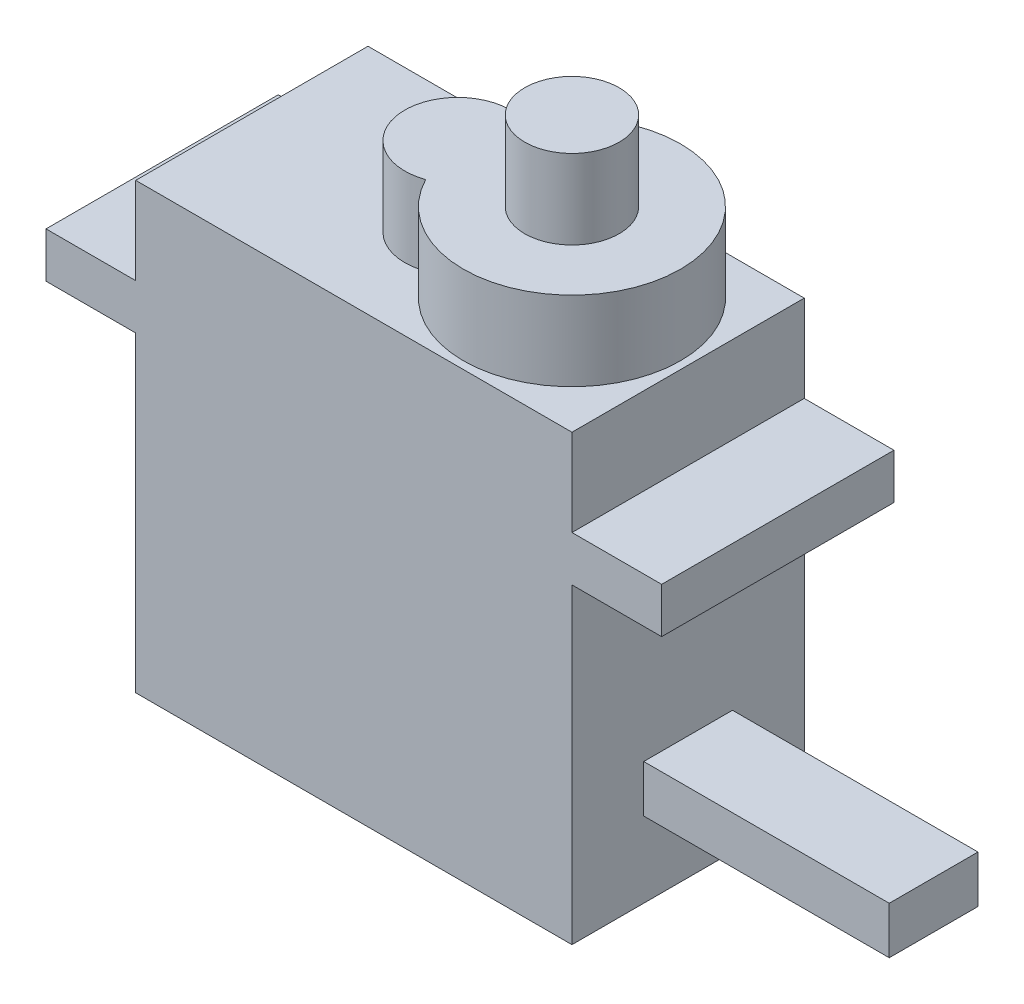
ISO-10303-21;
HEADER;
FILE_DESCRIPTION(('STEP AP214'),'2;1');
FILE_NAME('part.step','',(''),(''),'','','');
FILE_SCHEMA(('AUTOMOTIVE_DESIGN { 1 0 10303 214 1 1 1 1 }'));
ENDSEC;
DATA;
#1=APPLICATION_CONTEXT('core data for automotive mechanical design processes');
#2=APPLICATION_PROTOCOL_DEFINITION('international standard','automotive_design',2000,#1);
#3=PRODUCT_CONTEXT('',#1,'mechanical');
#4=PRODUCT('Part','Part','',(#3));
#5=PRODUCT_RELATED_PRODUCT_CATEGORY('part','',(#4));
#6=PRODUCT_DEFINITION_FORMATION('','',#4);
#7=PRODUCT_DEFINITION_CONTEXT('part definition',#1,'design');
#8=PRODUCT_DEFINITION('design','',#6,#7);
#9=PRODUCT_DEFINITION_SHAPE('','',#8);
#10=(LENGTH_UNIT() NAMED_UNIT(*) SI_UNIT(.MILLI.,.METRE.));
#11=(NAMED_UNIT(*) PLANE_ANGLE_UNIT() SI_UNIT($,.RADIAN.));
#12=(NAMED_UNIT(*) SI_UNIT($,.STERADIAN.) SOLID_ANGLE_UNIT());
#13=UNCERTAINTY_MEASURE_WITH_UNIT(LENGTH_MEASURE(1.E-05),#10,'distance_accuracy_value','');
#14=(GEOMETRIC_REPRESENTATION_CONTEXT(3) GLOBAL_UNCERTAINTY_ASSIGNED_CONTEXT((#13)) GLOBAL_UNIT_ASSIGNED_CONTEXT((#10,
#11,#12)) REPRESENTATION_CONTEXT('',''));
#15=CARTESIAN_POINT('',(0.,0.,0.));
#16=DIRECTION('',(0.,0.,1.));
#17=DIRECTION('',(1.,0.,0.));
#18=AXIS2_PLACEMENT_3D('',#15,#16,#17);
#19=CARTESIAN_POINT('',(11.55,0.,12.3));
#20=DIRECTION('',(1.,0.,0.));
#21=DIRECTION('',(0.,1.,0.));
#22=AXIS2_PLACEMENT_3D('',#19,#20,#21);
#23=PLANE('',#22);
#24=DIRECTION('',(0.,-1.,0.));
#25=VECTOR('',#24,1.);
#26=CARTESIAN_POINT('',(11.55,0.,0.));
#27=LINE('',#26,#25);
#28=CARTESIAN_POINT('',(11.55,4.75,0.));
#29=VERTEX_POINT('',#28);
#30=CARTESIAN_POINT('',(11.55,-11.75,0.));
#31=VERTEX_POINT('',#30);
#32=EDGE_CURVE('E286',#29,#31,#27,.T.);
#33=ORIENTED_EDGE('',*,*,#32,.F.);
#34=DIRECTION('',(0.,0.,-1.));
#35=VECTOR('',#34,1.);
#36=CARTESIAN_POINT('',(11.55,4.75,12.3));
#37=LINE('',#36,#35);
#38=CARTESIAN_POINT('',(11.55,4.75,12.3));
#39=VERTEX_POINT('',#38);
#40=EDGE_CURVE('E312',#39,#29,#37,.T.);
#41=ORIENTED_EDGE('',*,*,#40,.F.);
#42=DIRECTION('',(0.,-1.,0.));
#43=VECTOR('',#42,1.);
#44=CARTESIAN_POINT('',(11.55,0.,12.3));
#45=LINE('',#44,#43);
#46=CARTESIAN_POINT('',(11.55,-11.75,12.3));
#47=VERTEX_POINT('',#46);
#48=EDGE_CURVE('E254',#39,#47,#45,.T.);
#49=ORIENTED_EDGE('',*,*,#48,.T.);
#50=DIRECTION('',(0.,0.,-1.));
#51=VECTOR('',#50,1.);
#52=CARTESIAN_POINT('',(11.55,-11.75,12.3));
#53=LINE('',#52,#51);
#54=EDGE_CURVE('E314',#47,#31,#53,.T.);
#55=ORIENTED_EDGE('',*,*,#54,.T.);
#56=EDGE_LOOP('',(#33,#41,#49,#55));
#57=FACE_BOUND('',#56,.T.);
#58=DIRECTION('',(0.,-1.,0.));
#59=VECTOR('',#58,1.);
#60=CARTESIAN_POINT('',(11.55,-5.25,3.8));
#61=LINE('',#60,#59);
#62=CARTESIAN_POINT('',(11.55,-5.25,3.8));
#63=VERTEX_POINT('',#62);
#64=CARTESIAN_POINT('',(11.55,-7.75,3.8));
#65=VERTEX_POINT('',#64);
#66=EDGE_CURVE('E210',#63,#65,#61,.T.);
#67=ORIENTED_EDGE('',*,*,#66,.T.);
#68=DIRECTION('',(0.,0.,-1.));
#69=VECTOR('',#68,1.);
#70=CARTESIAN_POINT('',(11.55,-7.75,8.5));
#71=LINE('',#70,#69);
#72=CARTESIAN_POINT('',(11.55,-7.75,8.5));
#73=VERTEX_POINT('',#72);
#74=EDGE_CURVE('E208',#73,#65,#71,.T.);
#75=ORIENTED_EDGE('',*,*,#74,.F.);
#76=DIRECTION('',(0.,-1.,0.));
#77=VECTOR('',#76,1.);
#78=CARTESIAN_POINT('',(11.55,-5.25,8.5));
#79=LINE('',#78,#77);
#80=CARTESIAN_POINT('',(11.55,-5.25,8.5));
#81=VERTEX_POINT('',#80);
#82=EDGE_CURVE('E182',#81,#73,#79,.T.);
#83=ORIENTED_EDGE('',*,*,#82,.F.);
#84=DIRECTION('',(0.,0.,-1.));
#85=VECTOR('',#84,1.);
#86=CARTESIAN_POINT('',(11.55,-5.25,8.5));
#87=LINE('',#86,#85);
#88=EDGE_CURVE('E67',#81,#63,#87,.T.);
#89=ORIENTED_EDGE('',*,*,#88,.T.);
#90=EDGE_LOOP('',(#67,#75,#83,#89));
#91=FACE_BOUND('',#90,.T.);
#92=ADVANCED_FACE('F51',(#57,#91),#23,.T.);
#93=CARTESIAN_POINT('',(-11.55,0.,12.3));
#94=DIRECTION('',(1.,0.,0.));
#95=DIRECTION('',(0.,1.,0.));
#96=AXIS2_PLACEMENT_3D('',#93,#94,#95);
#97=PLANE('',#96);
#98=DIRECTION('',(0.,-1.,0.));
#99=VECTOR('',#98,1.);
#100=CARTESIAN_POINT('',(-11.55,0.,0.));
#101=LINE('',#100,#99);
#102=CARTESIAN_POINT('',(-11.55,11.75,0.));
#103=VERTEX_POINT('',#102);
#104=CARTESIAN_POINT('',(-11.55,7.15,0.));
#105=VERTEX_POINT('',#104);
#106=EDGE_CURVE('E239',#103,#105,#101,.T.);
#107=ORIENTED_EDGE('',*,*,#106,.T.);
#108=DIRECTION('',(0.,0.,-1.));
#109=VECTOR('',#108,1.);
#110=CARTESIAN_POINT('',(-11.55,7.15,12.3));
#111=LINE('',#110,#109);
#112=CARTESIAN_POINT('',(-11.55,7.15,12.3));
#113=VERTEX_POINT('',#112);
#114=EDGE_CURVE('E11',#113,#105,#111,.T.);
#115=ORIENTED_EDGE('',*,*,#114,.F.);
#116=DIRECTION('',(0.,-1.,0.));
#117=VECTOR('',#116,1.);
#118=CARTESIAN_POINT('',(-11.55,0.,12.3));
#119=LINE('',#118,#117);
#120=CARTESIAN_POINT('',(-11.55,11.75,12.3));
#121=VERTEX_POINT('',#120);
#122=EDGE_CURVE('E240',#121,#113,#119,.T.);
#123=ORIENTED_EDGE('',*,*,#122,.F.);
#124=DIRECTION('',(0.,0.,-1.));
#125=VECTOR('',#124,1.);
#126=CARTESIAN_POINT('',(-11.55,11.75,12.3));
#127=LINE('',#126,#125);
#128=EDGE_CURVE('E271',#121,#103,#127,.T.);
#129=ORIENTED_EDGE('',*,*,#128,.T.);
#130=EDGE_LOOP('',(#107,#115,#123,#129));
#131=FACE_BOUND('',#130,.T.);
#132=ADVANCED_FACE('F53',(#131),#97,.F.);
#133=CARTESIAN_POINT('',(0.,7.15,12.3));
#134=DIRECTION('',(0.,1.,0.));
#135=DIRECTION('',(-1.,0.,0.));
#136=AXIS2_PLACEMENT_3D('',#133,#134,#135);
#137=PLANE('',#136);
#138=CARTESIAN_POINT('',(-13.925,7.15,6.15));
#139=DIRECTION('',(0.,1.,0.));
#140=DIRECTION('',(-1.,0.,0.));
#141=AXIS2_PLACEMENT_3D('',#138,#139,#140);
#142=CIRCLE('',#141,0.965000000000001);
#143=CARTESIAN_POINT('',(-14.89,7.15,6.15));
#144=VERTEX_POINT('',#143);
#145=EDGE_CURVE('E203',#144,#144,#142,.T.);
#146=ORIENTED_EDGE('',*,*,#145,.F.);
#147=EDGE_LOOP('',(#146));
#148=FACE_BOUND('',#147,.T.);
#149=DIRECTION('',(1.,0.,0.));
#150=VECTOR('',#149,1.);
#151=CARTESIAN_POINT('',(0.,7.15,0.));
#152=LINE('',#151,#150);
#153=CARTESIAN_POINT('',(-16.3,7.15,0.));
#154=VERTEX_POINT('',#153);
#155=EDGE_CURVE('E274',#154,#105,#152,.T.);
#156=ORIENTED_EDGE('',*,*,#155,.F.);
#157=DIRECTION('',(0.,0.,-1.));
#158=VECTOR('',#157,1.);
#159=CARTESIAN_POINT('',(-16.3,7.15,12.3));
#160=LINE('',#159,#158);
#161=CARTESIAN_POINT('',(-16.3,7.15,12.3));
#162=VERTEX_POINT('',#161);
#163=EDGE_CURVE('E60',#162,#154,#160,.T.);
#164=ORIENTED_EDGE('',*,*,#163,.F.);
#165=DIRECTION('',(1.,0.,0.));
#166=VECTOR('',#165,1.);
#167=CARTESIAN_POINT('',(0.,7.15,12.3));
#168=LINE('',#167,#166);
#169=EDGE_CURVE('E242',#162,#113,#168,.T.);
#170=ORIENTED_EDGE('',*,*,#169,.T.);
#171=ORIENTED_EDGE('',*,*,#114,.T.);
#172=EDGE_LOOP('',(#156,#164,#170,#171));
#173=FACE_BOUND('',#172,.T.);
#174=ADVANCED_FACE('F338',(#148,#173),#137,.T.);
#175=CARTESIAN_POINT('',(-16.3,0.,12.3));
#176=DIRECTION('',(1.,0.,0.));
#177=DIRECTION('',(0.,0.,-1.));
#178=AXIS2_PLACEMENT_3D('',#175,#176,#177);
#179=PLANE('',#178);
#180=DIRECTION('',(0.,-1.,0.));
#181=VECTOR('',#180,1.);
#182=CARTESIAN_POINT('',(-16.3,0.,0.));
#183=LINE('',#182,#181);
#184=CARTESIAN_POINT('',(-16.3,4.75,0.));
#185=VERTEX_POINT('',#184);
#186=EDGE_CURVE('E277',#154,#185,#183,.T.);
#187=ORIENTED_EDGE('',*,*,#186,.T.);
#188=DIRECTION('',(0.,0.,-1.));
#189=VECTOR('',#188,1.);
#190=CARTESIAN_POINT('',(-16.3,4.75,12.3));
#191=LINE('',#190,#189);
#192=CARTESIAN_POINT('',(-16.3,4.75,12.3));
#193=VERTEX_POINT('',#192);
#194=EDGE_CURVE('E322',#193,#185,#191,.T.);
#195=ORIENTED_EDGE('',*,*,#194,.F.);
#196=DIRECTION('',(0.,-1.,0.));
#197=VECTOR('',#196,1.);
#198=CARTESIAN_POINT('',(-16.3,0.,12.3));
#199=LINE('',#198,#197);
#200=EDGE_CURVE('E246',#162,#193,#199,.T.);
#201=ORIENTED_EDGE('',*,*,#200,.F.);
#202=ORIENTED_EDGE('',*,*,#163,.T.);
#203=EDGE_LOOP('',(#187,#195,#201,#202));
#204=FACE_BOUND('',#203,.T.);
#205=ADVANCED_FACE('F328',(#204),#179,.F.);
#206=CARTESIAN_POINT('',(0.,4.75,12.3));
#207=DIRECTION('',(0.,1.,0.));
#208=DIRECTION('',(0.,0.,1.));
#209=AXIS2_PLACEMENT_3D('',#206,#207,#208);
#210=PLANE('',#209);
#211=CARTESIAN_POINT('',(-13.925,4.75,6.15));
#212=DIRECTION('',(0.,1.,0.));
#213=DIRECTION('',(0.,0.,1.));
#214=AXIS2_PLACEMENT_3D('',#211,#212,#213);
#215=CIRCLE('',#214,0.965000000000001);
#216=CARTESIAN_POINT('',(-13.925,4.75,7.115));
#217=VERTEX_POINT('',#216);
#218=EDGE_CURVE('E55',#217,#217,#215,.T.);
#219=ORIENTED_EDGE('',*,*,#218,.T.);
#220=EDGE_LOOP('',(#219));
#221=FACE_BOUND('',#220,.T.);
#222=DIRECTION('',(1.,0.,0.));
#223=VECTOR('',#222,1.);
#224=CARTESIAN_POINT('',(0.,4.75,0.));
#225=LINE('',#224,#223);
#226=CARTESIAN_POINT('',(-11.55,4.75,0.));
#227=VERTEX_POINT('',#226);
#228=EDGE_CURVE('E279',#185,#227,#225,.T.);
#229=ORIENTED_EDGE('',*,*,#228,.T.);
#230=DIRECTION('',(0.,0.,-1.));
#231=VECTOR('',#230,1.);
#232=CARTESIAN_POINT('',(-11.55,4.75,12.3));
#233=LINE('',#232,#231);
#234=CARTESIAN_POINT('',(-11.55,4.75,12.3));
#235=VERTEX_POINT('',#234);
#236=EDGE_CURVE('E319',#235,#227,#233,.T.);
#237=ORIENTED_EDGE('',*,*,#236,.F.);
#238=DIRECTION('',(1.,0.,0.));
#239=VECTOR('',#238,1.);
#240=CARTESIAN_POINT('',(0.,4.75,12.3));
#241=LINE('',#240,#239);
#242=EDGE_CURVE('E248',#193,#235,#241,.T.);
#243=ORIENTED_EDGE('',*,*,#242,.F.);
#244=ORIENTED_EDGE('',*,*,#194,.T.);
#245=EDGE_LOOP('',(#229,#237,#243,#244));
#246=FACE_BOUND('',#245,.T.);
#247=ADVANCED_FACE('F379',(#221,#246),#210,.F.);
#248=CARTESIAN_POINT('',(-11.55,0.,12.3));
#249=DIRECTION('',(1.,0.,0.));
#250=DIRECTION('',(0.,1.,0.));
#251=AXIS2_PLACEMENT_3D('',#248,#249,#250);
#252=PLANE('',#251);
#253=DIRECTION('',(0.,-1.,0.));
#254=VECTOR('',#253,1.);
#255=CARTESIAN_POINT('',(-11.55,0.,0.));
#256=LINE('',#255,#254);
#257=CARTESIAN_POINT('',(-11.55,-11.75,0.));
#258=VERTEX_POINT('',#257);
#259=EDGE_CURVE('E281',#227,#258,#256,.T.);
#260=ORIENTED_EDGE('',*,*,#259,.T.);
#261=DIRECTION('',(0.,0.,-1.));
#262=VECTOR('',#261,1.);
#263=CARTESIAN_POINT('',(-11.55,-11.75,12.3));
#264=LINE('',#263,#262);
#265=CARTESIAN_POINT('',(-11.55,-11.75,12.3));
#266=VERTEX_POINT('',#265);
#267=EDGE_CURVE('E316',#266,#258,#264,.T.);
#268=ORIENTED_EDGE('',*,*,#267,.F.);
#269=DIRECTION('',(0.,-1.,0.));
#270=VECTOR('',#269,1.);
#271=CARTESIAN_POINT('',(-11.55,0.,12.3));
#272=LINE('',#271,#270);
#273=EDGE_CURVE('E250',#235,#266,#272,.T.);
#274=ORIENTED_EDGE('',*,*,#273,.F.);
#275=ORIENTED_EDGE('',*,*,#236,.T.);
#276=EDGE_LOOP('',(#260,#268,#274,#275));
#277=FACE_BOUND('',#276,.T.);
#278=ADVANCED_FACE('F374',(#277),#252,.F.);
#279=CARTESIAN_POINT('',(0.,-11.75,12.3));
#280=DIRECTION('',(0.,1.,0.));
#281=DIRECTION('',(0.,0.,1.));
#282=AXIS2_PLACEMENT_3D('',#279,#280,#281);
#283=PLANE('',#282);
#284=DIRECTION('',(1.,0.,0.));
#285=VECTOR('',#284,1.);
#286=CARTESIAN_POINT('',(0.,-11.75,0.));
#287=LINE('',#286,#285);
#288=EDGE_CURVE('E283',#258,#31,#287,.T.);
#289=ORIENTED_EDGE('',*,*,#288,.T.);
#290=ORIENTED_EDGE('',*,*,#54,.F.);
#291=DIRECTION('',(1.,0.,0.));
#292=VECTOR('',#291,1.);
#293=CARTESIAN_POINT('',(0.,-11.75,12.3));
#294=LINE('',#293,#292);
#295=EDGE_CURVE('E252',#266,#47,#294,.T.);
#296=ORIENTED_EDGE('',*,*,#295,.F.);
#297=ORIENTED_EDGE('',*,*,#267,.T.);
#298=EDGE_LOOP('',(#289,#290,#296,#297));
#299=FACE_BOUND('',#298,.T.);
#300=ADVANCED_FACE('F371',(#299),#283,.F.);
#301=CARTESIAN_POINT('',(0.,4.75,12.3));
#302=DIRECTION('',(0.,1.,0.));
#303=DIRECTION('',(0.,0.,1.));
#304=AXIS2_PLACEMENT_3D('',#301,#302,#303);
#305=PLANE('',#304);
#306=DIRECTION('',(1.,0.,0.));
#307=VECTOR('',#306,1.);
#308=CARTESIAN_POINT('',(0.,4.75,0.));
#309=LINE('',#308,#307);
#310=CARTESIAN_POINT('',(16.3,4.75,0.));
#311=VERTEX_POINT('',#310);
#312=EDGE_CURVE('E289',#29,#311,#309,.T.);
#313=ORIENTED_EDGE('',*,*,#312,.T.);
#314=DIRECTION('',(0.,0.,-1.));
#315=VECTOR('',#314,1.);
#316=CARTESIAN_POINT('',(16.3,4.75,12.3));
#317=LINE('',#316,#315);
#318=CARTESIAN_POINT('',(16.3,4.75,12.3));
#319=VERTEX_POINT('',#318);
#320=EDGE_CURVE('E310',#319,#311,#317,.T.);
#321=ORIENTED_EDGE('',*,*,#320,.F.);
#322=DIRECTION('',(1.,0.,0.));
#323=VECTOR('',#322,1.);
#324=CARTESIAN_POINT('',(0.,4.75,12.3));
#325=LINE('',#324,#323);
#326=EDGE_CURVE('E257',#39,#319,#325,.T.);
#327=ORIENTED_EDGE('',*,*,#326,.F.);
#328=ORIENTED_EDGE('',*,*,#40,.T.);
#329=EDGE_LOOP('',(#313,#321,#327,#328));
#330=FACE_BOUND('',#329,.T.);
#331=ADVANCED_FACE('F362',(#330),#305,.F.);
#332=CARTESIAN_POINT('',(16.3,0.,12.3));
#333=DIRECTION('',(1.,0.,0.));
#334=DIRECTION('',(0.,0.,-1.));
#335=AXIS2_PLACEMENT_3D('',#332,#333,#334);
#336=PLANE('',#335);
#337=DIRECTION('',(0.,-1.,0.));
#338=VECTOR('',#337,1.);
#339=CARTESIAN_POINT('',(16.3,0.,0.));
#340=LINE('',#339,#338);
#341=CARTESIAN_POINT('',(16.3,7.15,0.));
#342=VERTEX_POINT('',#341);
#343=EDGE_CURVE('E292',#342,#311,#340,.T.);
#344=ORIENTED_EDGE('',*,*,#343,.F.);
#345=DIRECTION('',(0.,0.,-1.));
#346=VECTOR('',#345,1.);
#347=CARTESIAN_POINT('',(16.3,7.15,12.3));
#348=LINE('',#347,#346);
#349=CARTESIAN_POINT('',(16.3,7.15,12.3));
#350=VERTEX_POINT('',#349);
#351=EDGE_CURVE('E308',#350,#342,#348,.T.);
#352=ORIENTED_EDGE('',*,*,#351,.F.);
#353=DIRECTION('',(0.,-1.,0.));
#354=VECTOR('',#353,1.);
#355=CARTESIAN_POINT('',(16.3,0.,12.3));
#356=LINE('',#355,#354);
#357=EDGE_CURVE('E259',#350,#319,#356,.T.);
#358=ORIENTED_EDGE('',*,*,#357,.T.);
#359=ORIENTED_EDGE('',*,*,#320,.T.);
#360=EDGE_LOOP('',(#344,#352,#358,#359));
#361=FACE_BOUND('',#360,.T.);
#362=ADVANCED_FACE('F358',(#361),#336,.T.);
#363=CARTESIAN_POINT('',(0.,7.15,12.3));
#364=DIRECTION('',(0.,1.,0.));
#365=DIRECTION('',(-1.,0.,0.));
#366=AXIS2_PLACEMENT_3D('',#363,#364,#365);
#367=PLANE('',#366);
#368=DIRECTION('',(1.,0.,0.));
#369=VECTOR('',#368,1.);
#370=CARTESIAN_POINT('',(0.,7.15,0.));
#371=LINE('',#370,#369);
#372=CARTESIAN_POINT('',(11.55,7.15,0.));
#373=VERTEX_POINT('',#372);
#374=EDGE_CURVE('E295',#373,#342,#371,.T.);
#375=ORIENTED_EDGE('',*,*,#374,.F.);
#376=DIRECTION('',(0.,0.,-1.));
#377=VECTOR('',#376,1.);
#378=CARTESIAN_POINT('',(11.55,7.15,12.3));
#379=LINE('',#378,#377);
#380=CARTESIAN_POINT('',(11.55,7.15,12.3));
#381=VERTEX_POINT('',#380);
#382=EDGE_CURVE('E306',#381,#373,#379,.T.);
#383=ORIENTED_EDGE('',*,*,#382,.F.);
#384=DIRECTION('',(1.,0.,0.));
#385=VECTOR('',#384,1.);
#386=CARTESIAN_POINT('',(0.,7.15,12.3));
#387=LINE('',#386,#385);
#388=EDGE_CURVE('E262',#381,#350,#387,.T.);
#389=ORIENTED_EDGE('',*,*,#388,.T.);
#390=ORIENTED_EDGE('',*,*,#351,.T.);
#391=EDGE_LOOP('',(#375,#383,#389,#390));
#392=FACE_BOUND('',#391,.T.);
#393=ADVANCED_FACE('F354',(#392),#367,.T.);
#394=CARTESIAN_POINT('',(11.55,0.,12.3));
#395=DIRECTION('',(1.,0.,0.));
#396=DIRECTION('',(0.,1.,0.));
#397=AXIS2_PLACEMENT_3D('',#394,#395,#396);
#398=PLANE('',#397);
#399=DIRECTION('',(0.,-1.,0.));
#400=VECTOR('',#399,1.);
#401=CARTESIAN_POINT('',(11.55,0.,0.));
#402=LINE('',#401,#400);
#403=CARTESIAN_POINT('',(11.55,11.75,0.));
#404=VERTEX_POINT('',#403);
#405=EDGE_CURVE('E298',#404,#373,#402,.T.);
#406=ORIENTED_EDGE('',*,*,#405,.F.);
#407=DIRECTION('',(0.,0.,-1.));
#408=VECTOR('',#407,1.);
#409=CARTESIAN_POINT('',(11.55,11.75,12.3));
#410=LINE('',#409,#408);
#411=CARTESIAN_POINT('',(11.55,11.75,12.3));
#412=VERTEX_POINT('',#411);
#413=EDGE_CURVE('E304',#412,#404,#410,.T.);
#414=ORIENTED_EDGE('',*,*,#413,.F.);
#415=DIRECTION('',(0.,-1.,0.));
#416=VECTOR('',#415,1.);
#417=CARTESIAN_POINT('',(11.55,0.,12.3));
#418=LINE('',#417,#416);
#419=EDGE_CURVE('E265',#412,#381,#418,.T.);
#420=ORIENTED_EDGE('',*,*,#419,.T.);
#421=ORIENTED_EDGE('',*,*,#382,.T.);
#422=EDGE_LOOP('',(#406,#414,#420,#421));
#423=FACE_BOUND('',#422,.T.);
#424=ADVANCED_FACE('F349',(#423),#398,.T.);
#425=CARTESIAN_POINT('',(0.,11.75,12.3));
#426=DIRECTION('',(0.,1.,0.));
#427=DIRECTION('',(0.,0.,1.));
#428=AXIS2_PLACEMENT_3D('',#425,#426,#427);
#429=PLANE('',#428);
#430=CARTESIAN_POINT('',(-0.649999999999996,11.75,6.15));
#431=DIRECTION('',(0.,1.,0.));
#432=DIRECTION('',(0.,0.,1.));
#433=AXIS2_PLACEMENT_3D('',#430,#431,#432);
#434=CIRCLE('',#433,2.8);
#435=CARTESIAN_POINT('',(0.290495867768598,11.75,3.51267796378406));
#436=VERTEX_POINT('',#435);
#437=CARTESIAN_POINT('',(0.290495867768598,11.75,8.78732203621595));
#438=VERTEX_POINT('',#437);
#439=EDGE_CURVE('E223',#436,#438,#434,.T.);
#440=ORIENTED_EDGE('',*,*,#439,.F.);
#441=CARTESIAN_POINT('',(5.4,11.75,6.15));
#442=DIRECTION('',(0.,1.,0.));
#443=DIRECTION('',(0.,0.,1.));
#444=AXIS2_PLACEMENT_3D('',#441,#442,#443);
#445=CIRCLE('',#444,5.75);
#446=EDGE_CURVE('E74',#438,#436,#445,.T.);
#447=ORIENTED_EDGE('',*,*,#446,.F.);
#448=EDGE_LOOP('',(#440,#447));
#449=FACE_BOUND('',#448,.T.);
#450=DIRECTION('',(1.,0.,0.));
#451=VECTOR('',#450,1.);
#452=CARTESIAN_POINT('',(0.,11.75,0.));
#453=LINE('',#452,#451);
#454=EDGE_CURVE('E243',#103,#404,#453,.T.);
#455=ORIENTED_EDGE('',*,*,#454,.F.);
#456=ORIENTED_EDGE('',*,*,#128,.F.);
#457=DIRECTION('',(1.,0.,0.));
#458=VECTOR('',#457,1.);
#459=CARTESIAN_POINT('',(0.,11.75,12.3));
#460=LINE('',#459,#458);
#461=EDGE_CURVE('E268',#121,#412,#460,.T.);
#462=ORIENTED_EDGE('',*,*,#461,.T.);
#463=ORIENTED_EDGE('',*,*,#413,.T.);
#464=EDGE_LOOP('',(#455,#456,#462,#463));
#465=FACE_BOUND('',#464,.T.);
#466=ADVANCED_FACE('F344',(#449,#465),#429,.T.);
#467=CARTESIAN_POINT('',(0.,0.,12.3));
#468=DIRECTION('',(0.,0.,1.));
#469=DIRECTION('',(1.,0.,0.));
#470=AXIS2_PLACEMENT_3D('',#467,#468,#469);
#471=PLANE('',#470);
#472=ORIENTED_EDGE('',*,*,#122,.T.);
#473=ORIENTED_EDGE('',*,*,#169,.F.);
#474=ORIENTED_EDGE('',*,*,#200,.T.);
#475=ORIENTED_EDGE('',*,*,#242,.T.);
#476=ORIENTED_EDGE('',*,*,#273,.T.);
#477=ORIENTED_EDGE('',*,*,#295,.T.);
#478=ORIENTED_EDGE('',*,*,#48,.F.);
#479=ORIENTED_EDGE('',*,*,#326,.T.);
#480=ORIENTED_EDGE('',*,*,#357,.F.);
#481=ORIENTED_EDGE('',*,*,#388,.F.);
#482=ORIENTED_EDGE('',*,*,#419,.F.);
#483=ORIENTED_EDGE('',*,*,#461,.F.);
#484=EDGE_LOOP('',(#472,#473,#474,#475,#476,#477,#478,#479,#480,#481,#482,#483));
#485=FACE_BOUND('',#484,.T.);
#486=ADVANCED_FACE('F381',(#485),#471,.T.);
#487=CARTESIAN_POINT('',(0.,0.,0.));
#488=DIRECTION('',(0.,0.,1.));
#489=DIRECTION('',(1.,0.,0.));
#490=AXIS2_PLACEMENT_3D('',#487,#488,#489);
#491=PLANE('',#490);
#492=ORIENTED_EDGE('',*,*,#106,.F.);
#493=ORIENTED_EDGE('',*,*,#454,.T.);
#494=ORIENTED_EDGE('',*,*,#405,.T.);
#495=ORIENTED_EDGE('',*,*,#374,.T.);
#496=ORIENTED_EDGE('',*,*,#343,.T.);
#497=ORIENTED_EDGE('',*,*,#312,.F.);
#498=ORIENTED_EDGE('',*,*,#32,.T.);
#499=ORIENTED_EDGE('',*,*,#288,.F.);
#500=ORIENTED_EDGE('',*,*,#259,.F.);
#501=ORIENTED_EDGE('',*,*,#228,.F.);
#502=ORIENTED_EDGE('',*,*,#186,.F.);
#503=ORIENTED_EDGE('',*,*,#155,.T.);
#504=EDGE_LOOP('',(#492,#493,#494,#495,#496,#497,#498,#499,#500,#501,#502,#503));
#505=FACE_BOUND('',#504,.T.);
#506=ADVANCED_FACE('F336',(#505),#491,.F.);
#507=CARTESIAN_POINT('',(-0.649999999999996,15.95,6.15));
#508=DIRECTION('',(0.,-1.,0.));
#509=DIRECTION('',(0.,0.,-1.));
#510=AXIS2_PLACEMENT_3D('',#507,#508,#509);
#511=CYLINDRICAL_SURFACE('',#510,2.8);
#512=ORIENTED_EDGE('',*,*,#439,.T.);
#513=DIRECTION('',(0.,-1.,0.));
#514=VECTOR('',#513,1.);
#515=CARTESIAN_POINT('',(0.290495867768598,15.95,8.78732203621595));
#516=LINE('',#515,#514);
#517=CARTESIAN_POINT('',(0.290495867768598,15.95,8.78732203621595));
#518=VERTEX_POINT('',#517);
#519=EDGE_CURVE('E237',#518,#438,#516,.T.);
#520=ORIENTED_EDGE('',*,*,#519,.F.);
#521=CARTESIAN_POINT('',(-0.649999999999996,15.95,6.15));
#522=DIRECTION('',(0.,1.,0.));
#523=DIRECTION('',(0.,0.,1.));
#524=AXIS2_PLACEMENT_3D('',#521,#522,#523);
#525=CIRCLE('',#524,2.8);
#526=CARTESIAN_POINT('',(0.290495867768598,15.95,3.51267796378406));
#527=VERTEX_POINT('',#526);
#528=EDGE_CURVE('E226',#527,#518,#525,.T.);
#529=ORIENTED_EDGE('',*,*,#528,.F.);
#530=DIRECTION('',(0.,-1.,0.));
#531=VECTOR('',#530,1.);
#532=CARTESIAN_POINT('',(0.290495867768598,15.95,3.51267796378406));
#533=LINE('',#532,#531);
#534=EDGE_CURVE('E231',#527,#436,#533,.T.);
#535=ORIENTED_EDGE('',*,*,#534,.T.);
#536=EDGE_LOOP('',(#512,#520,#529,#535));
#537=FACE_BOUND('',#536,.T.);
#538=ADVANCED_FACE('F388',(#537),#511,.T.);
#539=CARTESIAN_POINT('',(5.4,15.95,6.15));
#540=DIRECTION('',(0.,-1.,0.));
#541=DIRECTION('',(0.,0.,-1.));
#542=AXIS2_PLACEMENT_3D('',#539,#540,#541);
#543=CYLINDRICAL_SURFACE('',#542,5.75);
#544=ORIENTED_EDGE('',*,*,#446,.T.);
#545=ORIENTED_EDGE('',*,*,#534,.F.);
#546=CARTESIAN_POINT('',(5.4,15.95,6.15));
#547=DIRECTION('',(0.,1.,0.));
#548=DIRECTION('',(0.,0.,1.));
#549=AXIS2_PLACEMENT_3D('',#546,#547,#548);
#550=CIRCLE('',#549,5.75);
#551=EDGE_CURVE('E229',#518,#527,#550,.T.);
#552=ORIENTED_EDGE('',*,*,#551,.F.);
#553=ORIENTED_EDGE('',*,*,#519,.T.);
#554=EDGE_LOOP('',(#544,#545,#552,#553));
#555=FACE_BOUND('',#554,.T.);
#556=ADVANCED_FACE('F448',(#555),#543,.T.);
#557=CARTESIAN_POINT('',(0.,15.95,0.));
#558=DIRECTION('',(0.,1.,0.));
#559=DIRECTION('',(0.,0.,1.));
#560=AXIS2_PLACEMENT_3D('',#557,#558,#559);
#561=PLANE('',#560);
#562=CARTESIAN_POINT('',(5.4,15.95,6.15));
#563=DIRECTION('',(0.,1.,0.));
#564=DIRECTION('',(0.,0.,1.));
#565=AXIS2_PLACEMENT_3D('',#562,#563,#564);
#566=CIRCLE('',#565,2.5);
#567=CARTESIAN_POINT('',(5.4,15.95,8.65));
#568=VERTEX_POINT('',#567);
#569=EDGE_CURVE('E219',#568,#568,#566,.T.);
#570=ORIENTED_EDGE('',*,*,#569,.F.);
#571=EDGE_LOOP('',(#570));
#572=FACE_BOUND('',#571,.T.);
#573=ORIENTED_EDGE('',*,*,#528,.T.);
#574=ORIENTED_EDGE('',*,*,#551,.T.);
#575=EDGE_LOOP('',(#573,#574));
#576=FACE_BOUND('',#575,.T.);
#577=ADVANCED_FACE('F444',(#572,#576),#561,.T.);
#578=CARTESIAN_POINT('',(5.4,20.15,6.15));
#579=DIRECTION('',(0.,-1.,0.));
#580=DIRECTION('',(0.,0.,-1.));
#581=AXIS2_PLACEMENT_3D('',#578,#579,#580);
#582=CYLINDRICAL_SURFACE('',#581,2.5);
#583=CARTESIAN_POINT('',(5.4,20.15,6.15));
#584=DIRECTION('',(0.,1.,0.));
#585=DIRECTION('',(0.,0.,1.));
#586=AXIS2_PLACEMENT_3D('',#583,#584,#585);
#587=CIRCLE('',#586,2.5);
#588=CARTESIAN_POINT('',(5.4,20.15,8.65));
#589=VERTEX_POINT('',#588);
#590=EDGE_CURVE('E220',#589,#589,#587,.T.);
#591=ORIENTED_EDGE('',*,*,#590,.F.);
#592=EDGE_LOOP('',(#591));
#593=FACE_BOUND('',#592,.T.);
#594=ORIENTED_EDGE('',*,*,#569,.T.);
#595=EDGE_LOOP('',(#594));
#596=FACE_BOUND('',#595,.T.);
#597=ADVANCED_FACE('F440',(#593,#596),#582,.T.);
#598=CARTESIAN_POINT('',(5.4,20.15,6.15));
#599=DIRECTION('',(0.,1.,0.));
#600=DIRECTION('',(0.,0.,1.));
#601=AXIS2_PLACEMENT_3D('',#598,#599,#600);
#602=PLANE('',#601);
#603=ORIENTED_EDGE('',*,*,#590,.T.);
#604=EDGE_LOOP('',(#603));
#605=FACE_BOUND('',#604,.T.);
#606=ADVANCED_FACE('F437',(#605),#602,.T.);
#607=CARTESIAN_POINT('',(19.55,-7.75,8.5));
#608=DIRECTION('',(0.,1.,0.));
#609=DIRECTION('',(-1.,0.,0.));
#610=AXIS2_PLACEMENT_3D('',#607,#608,#609);
#611=PLANE('',#610);
#612=ORIENTED_EDGE('',*,*,#74,.T.);
#613=DIRECTION('',(-1.,0.,0.));
#614=VECTOR('',#613,1.);
#615=CARTESIAN_POINT('',(19.55,-7.75,3.8));
#616=LINE('',#615,#614);
#617=CARTESIAN_POINT('',(24.55,-7.75,3.8));
#618=VERTEX_POINT('',#617);
#619=EDGE_CURVE('E191',#618,#65,#616,.T.);
#620=ORIENTED_EDGE('',*,*,#619,.F.);
#621=DIRECTION('',(0.,0.,-1.));
#622=VECTOR('',#621,1.);
#623=CARTESIAN_POINT('',(24.55,-7.75,8.5));
#624=LINE('',#623,#622);
#625=CARTESIAN_POINT('',(24.55,-7.75,8.5));
#626=VERTEX_POINT('',#625);
#627=EDGE_CURVE('E189',#626,#618,#624,.T.);
#628=ORIENTED_EDGE('',*,*,#627,.F.);
#629=DIRECTION('',(-1.,0.,0.));
#630=VECTOR('',#629,1.);
#631=CARTESIAN_POINT('',(19.55,-7.75,8.5));
#632=LINE('',#631,#630);
#633=EDGE_CURVE('E176',#626,#73,#632,.T.);
#634=ORIENTED_EDGE('',*,*,#633,.T.);
#635=EDGE_LOOP('',(#612,#620,#628,#634));
#636=FACE_BOUND('',#635,.T.);
#637=ADVANCED_FACE('F190',(#636),#611,.F.);
#638=CARTESIAN_POINT('',(19.55,-5.25,3.8));
#639=DIRECTION('',(0.,0.,-1.));
#640=DIRECTION('',(0.,1.,0.));
#641=AXIS2_PLACEMENT_3D('',#638,#639,#640);
#642=PLANE('',#641);
#643=ORIENTED_EDGE('',*,*,#66,.F.);
#644=DIRECTION('',(-1.,0.,0.));
#645=VECTOR('',#644,1.);
#646=CARTESIAN_POINT('',(19.55,-5.25,3.8));
#647=LINE('',#646,#645);
#648=CARTESIAN_POINT('',(24.55,-5.25,3.8));
#649=VERTEX_POINT('',#648);
#650=EDGE_CURVE('E216',#649,#63,#647,.T.);
#651=ORIENTED_EDGE('',*,*,#650,.F.);
#652=DIRECTION('',(0.,1.,0.));
#653=VECTOR('',#652,1.);
#654=CARTESIAN_POINT('',(24.55,-7.75,3.8));
#655=LINE('',#654,#653);
#656=EDGE_CURVE('E195',#618,#649,#655,.T.);
#657=ORIENTED_EDGE('',*,*,#656,.F.);
#658=ORIENTED_EDGE('',*,*,#619,.T.);
#659=EDGE_LOOP('',(#643,#651,#657,#658));
#660=FACE_BOUND('',#659,.T.);
#661=ADVANCED_FACE('F431',(#660),#642,.T.);
#662=CARTESIAN_POINT('',(19.55,-5.25,8.5));
#663=DIRECTION('',(0.,1.,0.));
#664=DIRECTION('',(-1.,0.,0.));
#665=AXIS2_PLACEMENT_3D('',#662,#663,#664);
#666=PLANE('',#665);
#667=ORIENTED_EDGE('',*,*,#88,.F.);
#668=DIRECTION('',(-1.,0.,0.));
#669=VECTOR('',#668,1.);
#670=CARTESIAN_POINT('',(19.55,-5.25,8.5));
#671=LINE('',#670,#669);
#672=CARTESIAN_POINT('',(24.55,-5.25,8.5));
#673=VERTEX_POINT('',#672);
#674=EDGE_CURVE('E186',#673,#81,#671,.T.);
#675=ORIENTED_EDGE('',*,*,#674,.F.);
#676=DIRECTION('',(0.,0.,1.));
#677=VECTOR('',#676,1.);
#678=CARTESIAN_POINT('',(24.55,-5.25,3.8));
#679=LINE('',#678,#677);
#680=EDGE_CURVE('E200',#649,#673,#679,.T.);
#681=ORIENTED_EDGE('',*,*,#680,.F.);
#682=ORIENTED_EDGE('',*,*,#650,.T.);
#683=EDGE_LOOP('',(#667,#675,#681,#682));
#684=FACE_BOUND('',#683,.T.);
#685=ADVANCED_FACE('F428',(#684),#666,.T.);
#686=CARTESIAN_POINT('',(19.55,-5.25,8.5));
#687=DIRECTION('',(0.,0.,-1.));
#688=DIRECTION('',(0.,1.,0.));
#689=AXIS2_PLACEMENT_3D('',#686,#687,#688);
#690=PLANE('',#689);
#691=ORIENTED_EDGE('',*,*,#82,.T.);
#692=ORIENTED_EDGE('',*,*,#633,.F.);
#693=DIRECTION('',(0.,-1.,0.));
#694=VECTOR('',#693,1.);
#695=CARTESIAN_POINT('',(24.55,-5.25,8.5));
#696=LINE('',#695,#694);
#697=EDGE_CURVE('E180',#673,#626,#696,.T.);
#698=ORIENTED_EDGE('',*,*,#697,.F.);
#699=ORIENTED_EDGE('',*,*,#674,.T.);
#700=EDGE_LOOP('',(#691,#692,#698,#699));
#701=FACE_BOUND('',#700,.T.);
#702=ADVANCED_FACE('F178',(#701),#690,.F.);
#703=CARTESIAN_POINT('',(24.55,0.,0.));
#704=DIRECTION('',(1.,0.,0.));
#705=DIRECTION('',(0.,1.,0.));
#706=AXIS2_PLACEMENT_3D('',#703,#704,#705);
#707=PLANE('',#706);
#708=ORIENTED_EDGE('',*,*,#697,.T.);
#709=ORIENTED_EDGE('',*,*,#627,.T.);
#710=ORIENTED_EDGE('',*,*,#656,.T.);
#711=ORIENTED_EDGE('',*,*,#680,.T.);
#712=EDGE_LOOP('',(#708,#709,#710,#711));
#713=FACE_BOUND('',#712,.T.);
#714=ADVANCED_FACE('F198',(#713),#707,.T.);
#715=CARTESIAN_POINT('',(-13.925,0.149999999999998,6.15));
#716=DIRECTION('',(0.,1.,0.));
#717=DIRECTION('',(-1.,0.,0.));
#718=AXIS2_PLACEMENT_3D('',#715,#716,#717);
#719=CYLINDRICAL_SURFACE('',#718,0.965000000000001);
#720=ORIENTED_EDGE('',*,*,#145,.T.);
#721=EDGE_LOOP('',(#720));
#722=FACE_BOUND('',#721,.T.);
#723=ORIENTED_EDGE('',*,*,#218,.F.);
#724=EDGE_LOOP('',(#723));
#725=FACE_BOUND('',#724,.T.);
#726=ADVANCED_FACE('F415',(#722,#725),#719,.F.);
#727=CLOSED_SHELL('',(#92,#132,#174,#205,#247,#278,#300,#331,#362,#393,#424,#466,#486,#506,#538,
#556,#577,#597,#606,#637,#661,#685,#702,#714,#726));
#728=MANIFOLD_SOLID_BREP('B2',#727);
#729=ADVANCED_BREP_SHAPE_REPRESENTATION('',(#18,#728),#14);
#730=SHAPE_DEFINITION_REPRESENTATION(#9,#729);
ENDSEC;
END-ISO-10303-21;
